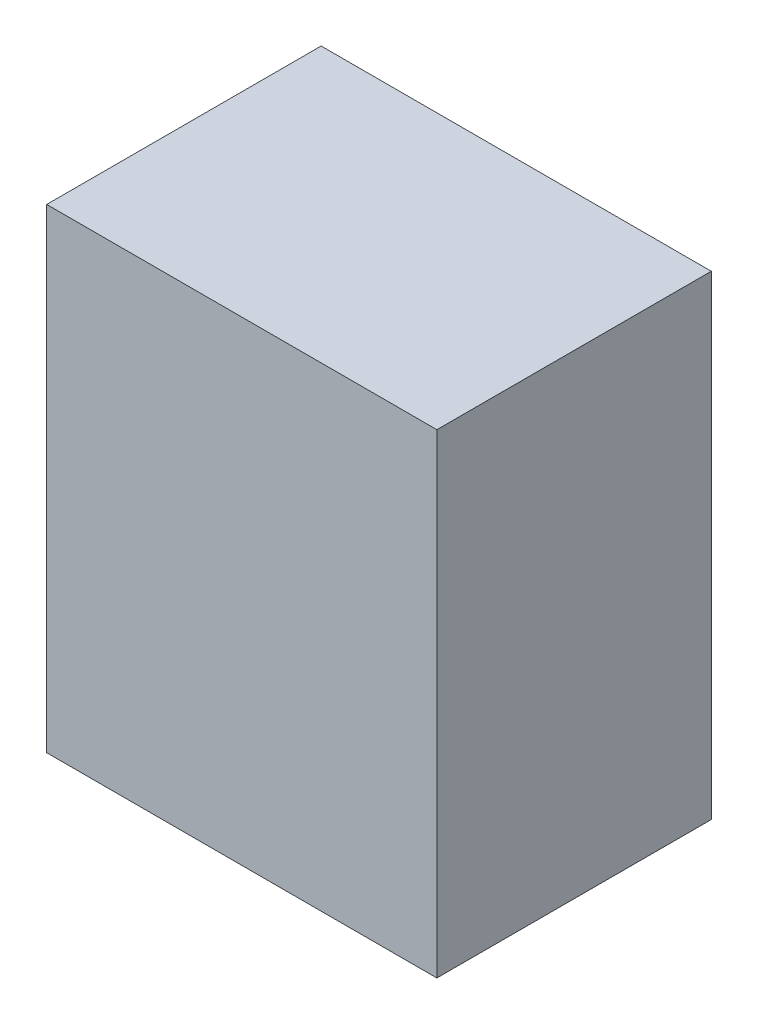
ISO-10303-21;
HEADER;
FILE_DESCRIPTION(('STEP AP214'),'2;1');
FILE_NAME('part.step','',(''),(''),'','','');
FILE_SCHEMA(('AUTOMOTIVE_DESIGN { 1 0 10303 214 1 1 1 1 }'));
ENDSEC;
DATA;
#1=APPLICATION_CONTEXT('core data for automotive mechanical design processes');
#2=APPLICATION_PROTOCOL_DEFINITION('international standard','automotive_design',2000,#1);
#3=PRODUCT_CONTEXT('',#1,'mechanical');
#4=PRODUCT('Part','Part','',(#3));
#5=PRODUCT_RELATED_PRODUCT_CATEGORY('part','',(#4));
#6=PRODUCT_DEFINITION_FORMATION('','',#4);
#7=PRODUCT_DEFINITION_CONTEXT('part definition',#1,'design');
#8=PRODUCT_DEFINITION('design','',#6,#7);
#9=PRODUCT_DEFINITION_SHAPE('','',#8);
#10=(LENGTH_UNIT() NAMED_UNIT(*) SI_UNIT(.MILLI.,.METRE.));
#11=(NAMED_UNIT(*) PLANE_ANGLE_UNIT() SI_UNIT($,.RADIAN.));
#12=(NAMED_UNIT(*) SI_UNIT($,.STERADIAN.) SOLID_ANGLE_UNIT());
#13=UNCERTAINTY_MEASURE_WITH_UNIT(LENGTH_MEASURE(1.E-05),#10,'distance_accuracy_value','');
#14=(GEOMETRIC_REPRESENTATION_CONTEXT(3) GLOBAL_UNCERTAINTY_ASSIGNED_CONTEXT((#13)) GLOBAL_UNIT_ASSIGNED_CONTEXT((#10,
#11,#12)) REPRESENTATION_CONTEXT('',''));
#15=CARTESIAN_POINT('',(0.,0.,0.));
#16=DIRECTION('',(0.,0.,1.));
#17=DIRECTION('',(1.,0.,0.));
#18=AXIS2_PLACEMENT_3D('',#15,#16,#17);
#19=CARTESIAN_POINT('',(34.5805407749177,231.,-95.9006857536962));
#20=DIRECTION('',(-1.,0.,0.));
#21=DIRECTION('',(0.,0.,1.));
#22=AXIS2_PLACEMENT_3D('',#19,#20,#21);
#23=PLANE('',#22);
#24=DIRECTION('',(0.,0.,-1.));
#25=VECTOR('',#24,1.);
#26=CARTESIAN_POINT('',(34.5805407749177,0.,-95.9006857536962));
#27=LINE('',#26,#25);
#28=CARTESIAN_POINT('',(34.5805407749177,0.,37.5962856099396));
#29=VERTEX_POINT('',#28);
#30=CARTESIAN_POINT('',(34.5805407749177,0.,-95.9006857536962));
#31=VERTEX_POINT('',#30);
#32=EDGE_CURVE('E96',#29,#31,#27,.T.);
#33=ORIENTED_EDGE('',*,*,#32,.T.);
#34=DIRECTION('',(0.,-1.,0.));
#35=VECTOR('',#34,1.);
#36=CARTESIAN_POINT('',(34.5805407749177,231.,-95.9006857536962));
#37=LINE('',#36,#35);
#38=CARTESIAN_POINT('',(34.5805407749177,231.,-95.9006857536962));
#39=VERTEX_POINT('',#38);
#40=EDGE_CURVE('E11',#39,#31,#37,.T.);
#41=ORIENTED_EDGE('',*,*,#40,.F.);
#42=DIRECTION('',(0.,0.,-1.));
#43=VECTOR('',#42,1.);
#44=CARTESIAN_POINT('',(34.5805407749177,231.,-95.9006857536962));
#45=LINE('',#44,#43);
#46=CARTESIAN_POINT('',(34.5805407749177,231.,37.5962856099396));
#47=VERTEX_POINT('',#46);
#48=EDGE_CURVE('E84',#47,#39,#45,.T.);
#49=ORIENTED_EDGE('',*,*,#48,.F.);
#50=DIRECTION('',(0.,-1.,0.));
#51=VECTOR('',#50,1.);
#52=CARTESIAN_POINT('',(34.5805407749177,231.,37.5962856099396));
#53=LINE('',#52,#51);
#54=EDGE_CURVE('E92',#47,#29,#53,.T.);
#55=ORIENTED_EDGE('',*,*,#54,.T.);
#56=EDGE_LOOP('',(#33,#41,#49,#55));
#57=FACE_BOUND('',#56,.T.);
#58=ADVANCED_FACE('F33',(#57),#23,.F.);
#59=CARTESIAN_POINT('',(-155.210334175793,231.,-95.9006857536962));
#60=DIRECTION('',(0.,0.,1.));
#61=DIRECTION('',(1.,0.,0.));
#62=AXIS2_PLACEMENT_3D('',#59,#60,#61);
#63=PLANE('',#62);
#64=DIRECTION('',(-1.,0.,0.));
#65=VECTOR('',#64,1.);
#66=CARTESIAN_POINT('',(-155.210334175793,0.,-95.9006857536962));
#67=LINE('',#66,#65);
#68=CARTESIAN_POINT('',(-155.210334175793,0.,-95.9006857536962));
#69=VERTEX_POINT('',#68);
#70=EDGE_CURVE('E88',#31,#69,#67,.T.);
#71=ORIENTED_EDGE('',*,*,#70,.T.);
#72=DIRECTION('',(0.,-1.,0.));
#73=VECTOR('',#72,1.);
#74=CARTESIAN_POINT('',(-155.210334175793,231.,-95.9006857536962));
#75=LINE('',#74,#73);
#76=CARTESIAN_POINT('',(-155.210334175793,231.,-95.9006857536962));
#77=VERTEX_POINT('',#76);
#78=EDGE_CURVE('E41',#77,#69,#75,.T.);
#79=ORIENTED_EDGE('',*,*,#78,.F.);
#80=DIRECTION('',(-1.,0.,0.));
#81=VECTOR('',#80,1.);
#82=CARTESIAN_POINT('',(-155.210334175793,231.,-95.9006857536962));
#83=LINE('',#82,#81);
#84=EDGE_CURVE('E79',#39,#77,#83,.T.);
#85=ORIENTED_EDGE('',*,*,#84,.F.);
#86=ORIENTED_EDGE('',*,*,#40,.T.);
#87=EDGE_LOOP('',(#71,#79,#85,#86));
#88=FACE_BOUND('',#87,.T.);
#89=ADVANCED_FACE('F87',(#88),#63,.F.);
#90=CARTESIAN_POINT('',(-155.210334175793,231.,-95.9006857536962));
#91=DIRECTION('',(1.,0.,0.));
#92=DIRECTION('',(0.,0.,-1.));
#93=AXIS2_PLACEMENT_3D('',#90,#91,#92);
#94=PLANE('',#93);
#95=DIRECTION('',(0.,0.,1.));
#96=VECTOR('',#95,1.);
#97=CARTESIAN_POINT('',(-155.210334175793,0.,-95.9006857536962));
#98=LINE('',#97,#96);
#99=CARTESIAN_POINT('',(-155.210334175793,0.,37.5962856099396));
#100=VERTEX_POINT('',#99);
#101=EDGE_CURVE('E66',#69,#100,#98,.T.);
#102=ORIENTED_EDGE('',*,*,#101,.T.);
#103=DIRECTION('',(0.,-1.,0.));
#104=VECTOR('',#103,1.);
#105=CARTESIAN_POINT('',(-155.210334175793,231.,37.5962856099396));
#106=LINE('',#105,#104);
#107=CARTESIAN_POINT('',(-155.210334175793,231.,37.5962856099396));
#108=VERTEX_POINT('',#107);
#109=EDGE_CURVE('E89',#108,#100,#106,.T.);
#110=ORIENTED_EDGE('',*,*,#109,.F.);
#111=DIRECTION('',(0.,0.,1.));
#112=VECTOR('',#111,1.);
#113=CARTESIAN_POINT('',(-155.210334175793,231.,-95.9006857536962));
#114=LINE('',#113,#112);
#115=EDGE_CURVE('E82',#77,#108,#114,.T.);
#116=ORIENTED_EDGE('',*,*,#115,.F.);
#117=ORIENTED_EDGE('',*,*,#78,.T.);
#118=EDGE_LOOP('',(#102,#110,#116,#117));
#119=FACE_BOUND('',#118,.T.);
#120=ADVANCED_FACE('F90',(#119),#94,.F.);
#121=CARTESIAN_POINT('',(-155.210334175793,231.,37.5962856099396));
#122=DIRECTION('',(0.,0.,-1.));
#123=DIRECTION('',(-1.,0.,0.));
#124=AXIS2_PLACEMENT_3D('',#121,#122,#123);
#125=PLANE('',#124);
#126=DIRECTION('',(1.,0.,0.));
#127=VECTOR('',#126,1.);
#128=CARTESIAN_POINT('',(-155.210334175793,0.,37.5962856099396));
#129=LINE('',#128,#127);
#130=EDGE_CURVE('E72',#100,#29,#129,.T.);
#131=ORIENTED_EDGE('',*,*,#130,.T.);
#132=ORIENTED_EDGE('',*,*,#54,.F.);
#133=DIRECTION('',(1.,0.,0.));
#134=VECTOR('',#133,1.);
#135=CARTESIAN_POINT('',(-155.210334175793,231.,37.5962856099396));
#136=LINE('',#135,#134);
#137=EDGE_CURVE('E49',#108,#47,#136,.T.);
#138=ORIENTED_EDGE('',*,*,#137,.F.);
#139=ORIENTED_EDGE('',*,*,#109,.T.);
#140=EDGE_LOOP('',(#131,#132,#138,#139));
#141=FACE_BOUND('',#140,.T.);
#142=ADVANCED_FACE('F103',(#141),#125,.F.);
#143=CARTESIAN_POINT('',(0.,231.,0.));
#144=DIRECTION('',(0.,1.,0.));
#145=DIRECTION('',(0.,0.,1.));
#146=AXIS2_PLACEMENT_3D('',#143,#144,#145);
#147=PLANE('',#146);
#148=ORIENTED_EDGE('',*,*,#48,.T.);
#149=ORIENTED_EDGE('',*,*,#84,.T.);
#150=ORIENTED_EDGE('',*,*,#115,.T.);
#151=ORIENTED_EDGE('',*,*,#137,.T.);
#152=EDGE_LOOP('',(#148,#149,#150,#151));
#153=FACE_BOUND('',#152,.T.);
#154=ADVANCED_FACE('F80',(#153),#147,.T.);
#155=CARTESIAN_POINT('',(0.,0.,0.));
#156=DIRECTION('',(0.,1.,0.));
#157=DIRECTION('',(0.,0.,1.));
#158=AXIS2_PLACEMENT_3D('',#155,#156,#157);
#159=PLANE('',#158);
#160=ORIENTED_EDGE('',*,*,#32,.F.);
#161=ORIENTED_EDGE('',*,*,#130,.F.);
#162=ORIENTED_EDGE('',*,*,#101,.F.);
#163=ORIENTED_EDGE('',*,*,#70,.F.);
#164=EDGE_LOOP('',(#160,#161,#162,#163));
#165=FACE_BOUND('',#164,.T.);
#166=ADVANCED_FACE('F106',(#165),#159,.F.);
#167=CLOSED_SHELL('',(#58,#89,#120,#142,#154,#166));
#168=MANIFOLD_SOLID_BREP('B2',#167);
#169=ADVANCED_BREP_SHAPE_REPRESENTATION('',(#18,#168),#14);
#170=SHAPE_DEFINITION_REPRESENTATION(#9,#169);
ENDSEC;
END-ISO-10303-21;
